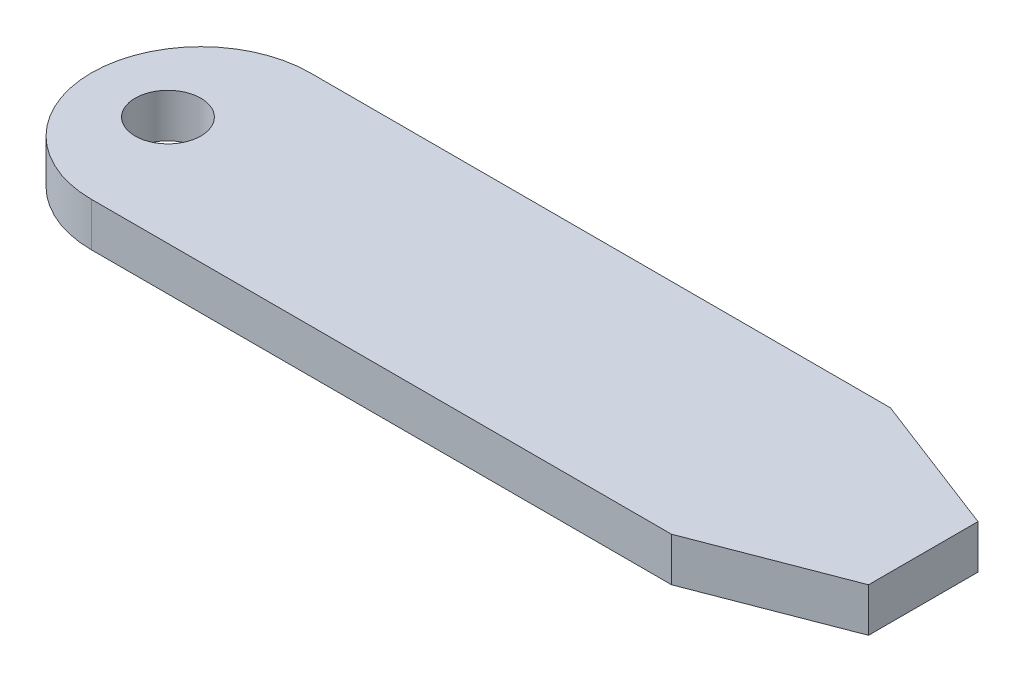
ISO-10303-21;
HEADER;
FILE_DESCRIPTION(('STEP AP214'),'2;1');
FILE_NAME('part.step','',(''),(''),'','','');
FILE_SCHEMA(('AUTOMOTIVE_DESIGN { 1 0 10303 214 1 1 1 1 }'));
ENDSEC;
DATA;
#1=APPLICATION_CONTEXT('core data for automotive mechanical design processes');
#2=APPLICATION_PROTOCOL_DEFINITION('international standard','automotive_design',2000,#1);
#3=PRODUCT_CONTEXT('',#1,'mechanical');
#4=PRODUCT('Part','Part','',(#3));
#5=PRODUCT_RELATED_PRODUCT_CATEGORY('part','',(#4));
#6=PRODUCT_DEFINITION_FORMATION('','',#4);
#7=PRODUCT_DEFINITION_CONTEXT('part definition',#1,'design');
#8=PRODUCT_DEFINITION('design','',#6,#7);
#9=PRODUCT_DEFINITION_SHAPE('','',#8);
#10=(LENGTH_UNIT() NAMED_UNIT(*) SI_UNIT(.MILLI.,.METRE.));
#11=(NAMED_UNIT(*) PLANE_ANGLE_UNIT() SI_UNIT($,.RADIAN.));
#12=(NAMED_UNIT(*) SI_UNIT($,.STERADIAN.) SOLID_ANGLE_UNIT());
#13=UNCERTAINTY_MEASURE_WITH_UNIT(LENGTH_MEASURE(1.E-05),#10,'distance_accuracy_value','');
#14=(GEOMETRIC_REPRESENTATION_CONTEXT(3) GLOBAL_UNCERTAINTY_ASSIGNED_CONTEXT((#13)) GLOBAL_UNIT_ASSIGNED_CONTEXT((#10,
#11,#12)) REPRESENTATION_CONTEXT('',''));
#15=CARTESIAN_POINT('',(0.,0.,0.));
#16=DIRECTION('',(0.,0.,1.));
#17=DIRECTION('',(1.,0.,0.));
#18=AXIS2_PLACEMENT_3D('',#15,#16,#17);
#19=CARTESIAN_POINT('',(0.,2.,0.));
#20=DIRECTION('',(0.,-1.,0.));
#21=DIRECTION('',(0.,0.,-1.));
#22=AXIS2_PLACEMENT_3D('',#19,#20,#21);
#23=PLANE('',#22);
#24=CARTESIAN_POINT('',(-8.,2.,0.));
#25=DIRECTION('',(0.,-1.,0.));
#26=DIRECTION('',(0.,0.,-1.));
#27=AXIS2_PLACEMENT_3D('',#24,#25,#26);
#28=CIRCLE('',#27,5.);
#29=CARTESIAN_POINT('',(-8.,2.,-5.));
#30=VERTEX_POINT('',#29);
#31=CARTESIAN_POINT('',(-13.,2.,0.));
#32=VERTEX_POINT('',#31);
#33=EDGE_CURVE('E61',#30,#32,#28,.F.);
#34=ORIENTED_EDGE('',*,*,#33,.T.);
#35=CARTESIAN_POINT('',(-8.,2.,0.));
#36=DIRECTION('',(0.,-1.,0.));
#37=DIRECTION('',(0.,0.,-1.));
#38=AXIS2_PLACEMENT_3D('',#35,#36,#37);
#39=CIRCLE('',#38,5.);
#40=CARTESIAN_POINT('',(-8.,2.,5.));
#41=VERTEX_POINT('',#40);
#42=EDGE_CURVE('E49',#32,#41,#39,.F.);
#43=ORIENTED_EDGE('',*,*,#42,.T.);
#44=DIRECTION('',(1.,0.,0.));
#45=VECTOR('',#44,1.);
#46=CARTESIAN_POINT('',(0.,2.,5.));
#47=LINE('',#46,#45);
#48=CARTESIAN_POINT('',(18.5,2.,5.));
#49=VERTEX_POINT('',#48);
#50=EDGE_CURVE('E98',#41,#49,#47,.T.);
#51=ORIENTED_EDGE('',*,*,#50,.T.);
#52=DIRECTION('',(0.93334560620306,0.,-0.358979079308869));
#53=VECTOR('',#52,1.);
#54=CARTESIAN_POINT('',(25.,2.,2.5));
#55=LINE('',#54,#53);
#56=CARTESIAN_POINT('',(25.,2.,2.5));
#57=VERTEX_POINT('',#56);
#58=EDGE_CURVE('E102',#49,#57,#55,.T.);
#59=ORIENTED_EDGE('',*,*,#58,.T.);
#60=DIRECTION('',(0.,0.,-1.));
#61=VECTOR('',#60,1.);
#62=CARTESIAN_POINT('',(25.,2.,0.));
#63=LINE('',#62,#61);
#64=CARTESIAN_POINT('',(25.,2.,-2.5));
#65=VERTEX_POINT('',#64);
#66=EDGE_CURVE('E127',#57,#65,#63,.T.);
#67=ORIENTED_EDGE('',*,*,#66,.T.);
#68=DIRECTION('',(-0.93334560620306,0.,-0.358979079308869));
#69=VECTOR('',#68,1.);
#70=CARTESIAN_POINT('',(25.,2.,-2.5));
#71=LINE('',#70,#69);
#72=CARTESIAN_POINT('',(18.5,2.,-5.));
#73=VERTEX_POINT('',#72);
#74=EDGE_CURVE('E130',#65,#73,#71,.T.);
#75=ORIENTED_EDGE('',*,*,#74,.T.);
#76=DIRECTION('',(-1.,0.,0.));
#77=VECTOR('',#76,1.);
#78=CARTESIAN_POINT('',(0.,2.,-5.));
#79=LINE('',#78,#77);
#80=EDGE_CURVE('E136',#73,#30,#79,.T.);
#81=ORIENTED_EDGE('',*,*,#80,.T.);
#82=EDGE_LOOP('',(#34,#43,#51,#59,#67,#75,#81));
#83=FACE_BOUND('',#82,.T.);
#84=CARTESIAN_POINT('',(-9.5,2.,0.));
#85=DIRECTION('',(0.,1.,0.));
#86=DIRECTION('',(0.,0.,1.));
#87=AXIS2_PLACEMENT_3D('',#84,#85,#86);
#88=CIRCLE('',#87,1.5);
#89=CARTESIAN_POINT('',(-9.5,2.,1.5));
#90=VERTEX_POINT('',#89);
#91=EDGE_CURVE('E143',#90,#90,#88,.T.);
#92=ORIENTED_EDGE('',*,*,#91,.F.);
#93=EDGE_LOOP('',(#92));
#94=FACE_BOUND('',#93,.T.);
#95=ADVANCED_FACE('F39',(#83,#94),#23,.F.);
#96=CARTESIAN_POINT('',(0.,0.,0.));
#97=DIRECTION('',(0.,-1.,0.));
#98=DIRECTION('',(0.,0.,-1.));
#99=AXIS2_PLACEMENT_3D('',#96,#97,#98);
#100=PLANE('',#99);
#101=DIRECTION('',(1.,0.,0.));
#102=VECTOR('',#101,1.);
#103=CARTESIAN_POINT('',(18.5,0.,5.));
#104=LINE('',#103,#102);
#105=CARTESIAN_POINT('',(-8.,0.,5.));
#106=VERTEX_POINT('',#105);
#107=CARTESIAN_POINT('',(18.5,0.,5.));
#108=VERTEX_POINT('',#107);
#109=EDGE_CURVE('E115',#106,#108,#104,.T.);
#110=ORIENTED_EDGE('',*,*,#109,.F.);
#111=CARTESIAN_POINT('',(-8.,0.,0.));
#112=DIRECTION('',(0.,-1.,0.));
#113=DIRECTION('',(0.,0.,-1.));
#114=AXIS2_PLACEMENT_3D('',#111,#112,#113);
#115=CIRCLE('',#114,5.);
#116=CARTESIAN_POINT('',(-13.,0.,0.));
#117=VERTEX_POINT('',#116);
#118=EDGE_CURVE('E169',#106,#117,#115,.T.);
#119=ORIENTED_EDGE('',*,*,#118,.T.);
#120=CARTESIAN_POINT('',(-8.,0.,0.));
#121=DIRECTION('',(0.,-1.,0.));
#122=DIRECTION('',(0.,0.,-1.));
#123=AXIS2_PLACEMENT_3D('',#120,#121,#122);
#124=CIRCLE('',#123,5.);
#125=CARTESIAN_POINT('',(-8.,0.,-5.));
#126=VERTEX_POINT('',#125);
#127=EDGE_CURVE('E166',#117,#126,#124,.T.);
#128=ORIENTED_EDGE('',*,*,#127,.T.);
#129=DIRECTION('',(-1.,0.,0.));
#130=VECTOR('',#129,1.);
#131=CARTESIAN_POINT('',(-13.,0.,-5.));
#132=LINE('',#131,#130);
#133=CARTESIAN_POINT('',(18.5,0.,-5.));
#134=VERTEX_POINT('',#133);
#135=EDGE_CURVE('E109',#134,#126,#132,.T.);
#136=ORIENTED_EDGE('',*,*,#135,.F.);
#137=DIRECTION('',(-0.93334560620306,0.,-0.358979079308869));
#138=VECTOR('',#137,1.);
#139=CARTESIAN_POINT('',(25.,0.,-2.5));
#140=LINE('',#139,#138);
#141=CARTESIAN_POINT('',(25.,0.,-2.5));
#142=VERTEX_POINT('',#141);
#143=EDGE_CURVE('E149',#142,#134,#140,.T.);
#144=ORIENTED_EDGE('',*,*,#143,.F.);
#145=DIRECTION('',(0.,0.,-1.));
#146=VECTOR('',#145,1.);
#147=CARTESIAN_POINT('',(25.,0.,-2.5));
#148=LINE('',#147,#146);
#149=CARTESIAN_POINT('',(25.,0.,2.5));
#150=VERTEX_POINT('',#149);
#151=EDGE_CURVE('E146',#150,#142,#148,.T.);
#152=ORIENTED_EDGE('',*,*,#151,.F.);
#153=DIRECTION('',(0.93334560620306,0.,-0.358979079308869));
#154=VECTOR('',#153,1.);
#155=CARTESIAN_POINT('',(25.,0.,2.5));
#156=LINE('',#155,#154);
#157=EDGE_CURVE('E142',#108,#150,#156,.T.);
#158=ORIENTED_EDGE('',*,*,#157,.F.);
#159=EDGE_LOOP('',(#110,#119,#128,#136,#144,#152,#158));
#160=FACE_BOUND('',#159,.T.);
#161=CARTESIAN_POINT('',(-9.5,0.,0.));
#162=DIRECTION('',(0.,1.,0.));
#163=DIRECTION('',(0.,0.,1.));
#164=AXIS2_PLACEMENT_3D('',#161,#162,#163);
#165=CIRCLE('',#164,1.5);
#166=CARTESIAN_POINT('',(-9.5,0.,1.5));
#167=VERTEX_POINT('',#166);
#168=EDGE_CURVE('E184',#167,#167,#165,.T.);
#169=ORIENTED_EDGE('',*,*,#168,.T.);
#170=EDGE_LOOP('',(#169));
#171=FACE_BOUND('',#170,.T.);
#172=ADVANCED_FACE('F177',(#160,#171),#100,.T.);
#173=CARTESIAN_POINT('',(18.5,2.,5.));
#174=DIRECTION('',(0.,0.,-1.));
#175=DIRECTION('',(-1.,0.,0.));
#176=AXIS2_PLACEMENT_3D('',#173,#174,#175);
#177=PLANE('',#176);
#178=ORIENTED_EDGE('',*,*,#50,.F.);
#179=DIRECTION('',(0.,-1.,0.));
#180=VECTOR('',#179,1.);
#181=CARTESIAN_POINT('',(-8.,2.,5.));
#182=LINE('',#181,#180);
#183=EDGE_CURVE('E120',#41,#106,#182,.T.);
#184=ORIENTED_EDGE('',*,*,#183,.T.);
#185=ORIENTED_EDGE('',*,*,#109,.T.);
#186=DIRECTION('',(0.,-1.,0.));
#187=VECTOR('',#186,1.);
#188=CARTESIAN_POINT('',(18.5,2.,5.));
#189=LINE('',#188,#187);
#190=EDGE_CURVE('E112',#49,#108,#189,.T.);
#191=ORIENTED_EDGE('',*,*,#190,.F.);
#192=EDGE_LOOP('',(#178,#184,#185,#191));
#193=FACE_BOUND('',#192,.T.);
#194=ADVANCED_FACE('F113',(#193),#177,.F.);
#195=CARTESIAN_POINT('',(25.,2.,2.5));
#196=DIRECTION('',(-0.358979079308869,0.,-0.933345606203059));
#197=DIRECTION('',(-0.933345606203059,0.,0.358979079308869));
#198=AXIS2_PLACEMENT_3D('',#195,#196,#197);
#199=PLANE('',#198);
#200=ORIENTED_EDGE('',*,*,#157,.T.);
#201=DIRECTION('',(0.,-1.,0.));
#202=VECTOR('',#201,1.);
#203=CARTESIAN_POINT('',(25.,2.,2.5));
#204=LINE('',#203,#202);
#205=EDGE_CURVE('E121',#57,#150,#204,.T.);
#206=ORIENTED_EDGE('',*,*,#205,.F.);
#207=ORIENTED_EDGE('',*,*,#58,.F.);
#208=ORIENTED_EDGE('',*,*,#190,.T.);
#209=EDGE_LOOP('',(#200,#206,#207,#208));
#210=FACE_BOUND('',#209,.T.);
#211=ADVANCED_FACE('F123',(#210),#199,.F.);
#212=CARTESIAN_POINT('',(25.,2.,-2.5));
#213=DIRECTION('',(-1.,0.,0.));
#214=DIRECTION('',(0.,0.,1.));
#215=AXIS2_PLACEMENT_3D('',#212,#213,#214);
#216=PLANE('',#215);
#217=ORIENTED_EDGE('',*,*,#151,.T.);
#218=DIRECTION('',(0.,-1.,0.));
#219=VECTOR('',#218,1.);
#220=CARTESIAN_POINT('',(25.,2.,-2.5));
#221=LINE('',#220,#219);
#222=EDGE_CURVE('E158',#65,#142,#221,.T.);
#223=ORIENTED_EDGE('',*,*,#222,.F.);
#224=ORIENTED_EDGE('',*,*,#66,.F.);
#225=ORIENTED_EDGE('',*,*,#205,.T.);
#226=EDGE_LOOP('',(#217,#223,#224,#225));
#227=FACE_BOUND('',#226,.T.);
#228=ADVANCED_FACE('F209',(#227),#216,.F.);
#229=CARTESIAN_POINT('',(25.,2.,-2.5));
#230=DIRECTION('',(-0.358979079308869,0.,0.93334560620306));
#231=DIRECTION('',(0.93334560620306,0.,0.358979079308869));
#232=AXIS2_PLACEMENT_3D('',#229,#230,#231);
#233=PLANE('',#232);
#234=ORIENTED_EDGE('',*,*,#143,.T.);
#235=DIRECTION('',(0.,-1.,0.));
#236=VECTOR('',#235,1.);
#237=CARTESIAN_POINT('',(18.5,2.,-5.));
#238=LINE('',#237,#236);
#239=EDGE_CURVE('E139',#73,#134,#238,.T.);
#240=ORIENTED_EDGE('',*,*,#239,.F.);
#241=ORIENTED_EDGE('',*,*,#74,.F.);
#242=ORIENTED_EDGE('',*,*,#222,.T.);
#243=EDGE_LOOP('',(#234,#240,#241,#242));
#244=FACE_BOUND('',#243,.T.);
#245=ADVANCED_FACE('F206',(#244),#233,.F.);
#246=CARTESIAN_POINT('',(-13.,2.,-5.));
#247=DIRECTION('',(0.,0.,1.));
#248=DIRECTION('',(1.,0.,0.));
#249=AXIS2_PLACEMENT_3D('',#246,#247,#248);
#250=PLANE('',#249);
#251=ORIENTED_EDGE('',*,*,#135,.T.);
#252=DIRECTION('',(0.,-1.,0.));
#253=VECTOR('',#252,1.);
#254=CARTESIAN_POINT('',(-8.,2.,-5.));
#255=LINE('',#254,#253);
#256=EDGE_CURVE('E11',#126,#30,#255,.F.);
#257=ORIENTED_EDGE('',*,*,#256,.T.);
#258=ORIENTED_EDGE('',*,*,#80,.F.);
#259=ORIENTED_EDGE('',*,*,#239,.T.);
#260=EDGE_LOOP('',(#251,#257,#258,#259));
#261=FACE_BOUND('',#260,.T.);
#262=ADVANCED_FACE('F203',(#261),#250,.F.);
#263=CARTESIAN_POINT('',(-9.5,2.,0.));
#264=DIRECTION('',(0.,-1.,0.));
#265=DIRECTION('',(0.,0.,-1.));
#266=AXIS2_PLACEMENT_3D('',#263,#264,#265);
#267=CYLINDRICAL_SURFACE('',#266,1.5);
#268=ORIENTED_EDGE('',*,*,#91,.T.);
#269=EDGE_LOOP('',(#268));
#270=FACE_BOUND('',#269,.T.);
#271=ORIENTED_EDGE('',*,*,#168,.F.);
#272=EDGE_LOOP('',(#271));
#273=FACE_BOUND('',#272,.T.);
#274=ADVANCED_FACE('F193',(#270,#273),#267,.F.);
#275=CARTESIAN_POINT('',(-8.,2.,0.));
#276=DIRECTION('',(0.,-1.,0.));
#277=DIRECTION('',(0.,0.,-1.));
#278=AXIS2_PLACEMENT_3D('',#275,#276,#277);
#279=CYLINDRICAL_SURFACE('',#278,5.);
#280=DIRECTION('',(0.,-1.,0.));
#281=VECTOR('',#280,1.);
#282=CARTESIAN_POINT('',(-13.,2.,0.));
#283=LINE('',#282,#281);
#284=EDGE_CURVE('E43',#32,#117,#283,.T.);
#285=ORIENTED_EDGE('',*,*,#284,.F.);
#286=ORIENTED_EDGE('',*,*,#33,.F.);
#287=ORIENTED_EDGE('',*,*,#256,.F.);
#288=ORIENTED_EDGE('',*,*,#127,.F.);
#289=EDGE_LOOP('',(#285,#286,#287,#288));
#290=FACE_BOUND('',#289,.T.);
#291=ADVANCED_FACE('F41',(#290),#279,.T.);
#292=CARTESIAN_POINT('',(-8.,2.,0.));
#293=DIRECTION('',(0.,-1.,0.));
#294=DIRECTION('',(0.,0.,-1.));
#295=AXIS2_PLACEMENT_3D('',#292,#293,#294);
#296=CYLINDRICAL_SURFACE('',#295,5.);
#297=ORIENTED_EDGE('',*,*,#42,.F.);
#298=ORIENTED_EDGE('',*,*,#284,.T.);
#299=ORIENTED_EDGE('',*,*,#118,.F.);
#300=ORIENTED_EDGE('',*,*,#183,.F.);
#301=EDGE_LOOP('',(#297,#298,#299,#300));
#302=FACE_BOUND('',#301,.T.);
#303=ADVANCED_FACE('F182',(#302),#296,.T.);
#304=CLOSED_SHELL('',(#95,#172,#194,#211,#228,#245,#262,#274,#291,#303));
#305=MANIFOLD_SOLID_BREP('B2',#304);
#306=ADVANCED_BREP_SHAPE_REPRESENTATION('',(#18,#305),#14);
#307=SHAPE_DEFINITION_REPRESENTATION(#9,#306);
ENDSEC;
END-ISO-10303-21;
